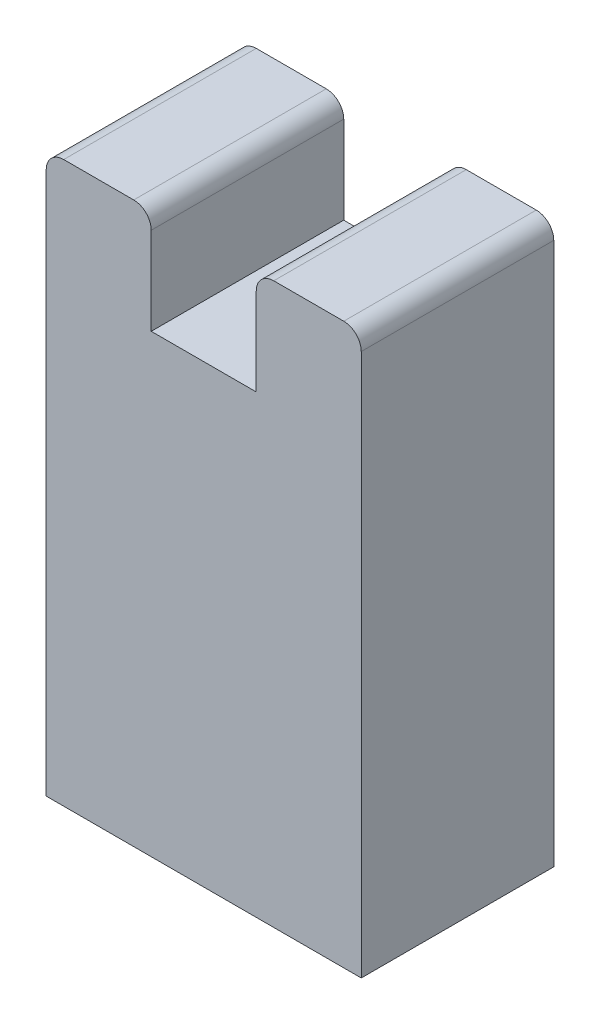
ISO-10303-21;
HEADER;
FILE_DESCRIPTION(('STEP AP214'),'2;1');
FILE_NAME('part.step','',(''),(''),'','','');
FILE_SCHEMA(('AUTOMOTIVE_DESIGN { 1 0 10303 214 1 1 1 1 }'));
ENDSEC;
DATA;
#1=APPLICATION_CONTEXT('core data for automotive mechanical design processes');
#2=APPLICATION_PROTOCOL_DEFINITION('international standard','automotive_design',2000,#1);
#3=PRODUCT_CONTEXT('',#1,'mechanical');
#4=PRODUCT('Part','Part','',(#3));
#5=PRODUCT_RELATED_PRODUCT_CATEGORY('part','',(#4));
#6=PRODUCT_DEFINITION_FORMATION('','',#4);
#7=PRODUCT_DEFINITION_CONTEXT('part definition',#1,'design');
#8=PRODUCT_DEFINITION('design','',#6,#7);
#9=PRODUCT_DEFINITION_SHAPE('','',#8);
#10=(LENGTH_UNIT() NAMED_UNIT(*) SI_UNIT(.MILLI.,.METRE.));
#11=(NAMED_UNIT(*) PLANE_ANGLE_UNIT() SI_UNIT($,.RADIAN.));
#12=(NAMED_UNIT(*) SI_UNIT($,.STERADIAN.) SOLID_ANGLE_UNIT());
#13=UNCERTAINTY_MEASURE_WITH_UNIT(LENGTH_MEASURE(1.E-05),#10,'distance_accuracy_value','');
#14=(GEOMETRIC_REPRESENTATION_CONTEXT(3) GLOBAL_UNCERTAINTY_ASSIGNED_CONTEXT((#13)) GLOBAL_UNIT_ASSIGNED_CONTEXT((#10,
#11,#12)) REPRESENTATION_CONTEXT('',''));
#15=CARTESIAN_POINT('',(0.,0.,0.));
#16=DIRECTION('',(0.,0.,1.));
#17=DIRECTION('',(1.,0.,0.));
#18=AXIS2_PLACEMENT_3D('',#15,#16,#17);
#19=CARTESIAN_POINT('',(0.,16.,5.5));
#20=DIRECTION('',(0.,-1.,0.));
#21=DIRECTION('',(0.,0.,-1.));
#22=AXIS2_PLACEMENT_3D('',#19,#20,#21);
#23=PLANE('',#22);
#24=DIRECTION('',(-1.,0.,0.));
#25=VECTOR('',#24,1.);
#26=CARTESIAN_POINT('',(0.,16.,5.5));
#27=LINE('',#26,#25);
#28=CARTESIAN_POINT('',(2.5,16.,5.5));
#29=VERTEX_POINT('',#28);
#30=CARTESIAN_POINT('',(0.5,16.,5.5));
#31=VERTEX_POINT('',#30);
#32=EDGE_CURVE('E168',#29,#31,#27,.T.);
#33=ORIENTED_EDGE('',*,*,#32,.F.);
#34=DIRECTION('',(0.,0.,1.));
#35=VECTOR('',#34,1.);
#36=CARTESIAN_POINT('',(2.5,16.,5.5));
#37=LINE('',#36,#35);
#38=CARTESIAN_POINT('',(2.5,16.,0.));
#39=VERTEX_POINT('',#38);
#40=EDGE_CURVE('E41',#29,#39,#37,.F.);
#41=ORIENTED_EDGE('',*,*,#40,.T.);
#42=DIRECTION('',(-1.,0.,0.));
#43=VECTOR('',#42,1.);
#44=CARTESIAN_POINT('',(0.,16.,0.));
#45=LINE('',#44,#43);
#46=CARTESIAN_POINT('',(0.5,16.,0.));
#47=VERTEX_POINT('',#46);
#48=EDGE_CURVE('E177',#39,#47,#45,.T.);
#49=ORIENTED_EDGE('',*,*,#48,.T.);
#50=DIRECTION('',(0.,0.,-1.));
#51=VECTOR('',#50,1.);
#52=CARTESIAN_POINT('',(0.5,16.,5.5));
#53=LINE('',#52,#51);
#54=EDGE_CURVE('E211',#47,#31,#53,.F.);
#55=ORIENTED_EDGE('',*,*,#54,.T.);
#56=EDGE_LOOP('',(#33,#41,#49,#55));
#57=FACE_BOUND('',#56,.T.);
#58=ADVANCED_FACE('F33',(#57),#23,.F.);
#59=CARTESIAN_POINT('',(0.,0.,5.5));
#60=DIRECTION('',(1.,0.,0.));
#61=DIRECTION('',(0.,0.,-1.));
#62=AXIS2_PLACEMENT_3D('',#59,#60,#61);
#63=PLANE('',#62);
#64=DIRECTION('',(0.,-1.,0.));
#65=VECTOR('',#64,1.);
#66=CARTESIAN_POINT('',(0.,0.,5.5));
#67=LINE('',#66,#65);
#68=CARTESIAN_POINT('',(0.,15.5,5.5));
#69=VERTEX_POINT('',#68);
#70=CARTESIAN_POINT('',(0.,0.,5.5));
#71=VERTEX_POINT('',#70);
#72=EDGE_CURVE('E160',#69,#71,#67,.T.);
#73=ORIENTED_EDGE('',*,*,#72,.F.);
#74=DIRECTION('',(0.,0.,-1.));
#75=VECTOR('',#74,1.);
#76=CARTESIAN_POINT('',(0.,15.5,5.5));
#77=LINE('',#76,#75);
#78=CARTESIAN_POINT('',(0.,15.5,0.));
#79=VERTEX_POINT('',#78);
#80=EDGE_CURVE('E11',#69,#79,#77,.T.);
#81=ORIENTED_EDGE('',*,*,#80,.T.);
#82=DIRECTION('',(0.,-1.,0.));
#83=VECTOR('',#82,1.);
#84=CARTESIAN_POINT('',(0.,0.,0.));
#85=LINE('',#84,#83);
#86=CARTESIAN_POINT('',(0.,0.,0.));
#87=VERTEX_POINT('',#86);
#88=EDGE_CURVE('E158',#79,#87,#85,.T.);
#89=ORIENTED_EDGE('',*,*,#88,.T.);
#90=DIRECTION('',(0.,0.,-1.));
#91=VECTOR('',#90,1.);
#92=CARTESIAN_POINT('',(0.,0.,5.5));
#93=LINE('',#92,#91);
#94=EDGE_CURVE('E183',#71,#87,#93,.T.);
#95=ORIENTED_EDGE('',*,*,#94,.F.);
#96=EDGE_LOOP('',(#73,#81,#89,#95));
#97=FACE_BOUND('',#96,.T.);
#98=ADVANCED_FACE('F247',(#97),#63,.F.);
#99=CARTESIAN_POINT('',(0.,0.,5.5));
#100=DIRECTION('',(0.,1.,0.));
#101=DIRECTION('',(0.,0.,1.));
#102=AXIS2_PLACEMENT_3D('',#99,#100,#101);
#103=PLANE('',#102);
#104=DIRECTION('',(1.,0.,0.));
#105=VECTOR('',#104,1.);
#106=CARTESIAN_POINT('',(0.,0.,0.));
#107=LINE('',#106,#105);
#108=CARTESIAN_POINT('',(9.,0.,0.));
#109=VERTEX_POINT('',#108);
#110=EDGE_CURVE('E172',#87,#109,#107,.T.);
#111=ORIENTED_EDGE('',*,*,#110,.T.);
#112=DIRECTION('',(0.,0.,-1.));
#113=VECTOR('',#112,1.);
#114=CARTESIAN_POINT('',(9.,0.,5.5));
#115=LINE('',#114,#113);
#116=CARTESIAN_POINT('',(9.,0.,5.5));
#117=VERTEX_POINT('',#116);
#118=EDGE_CURVE('E180',#117,#109,#115,.T.);
#119=ORIENTED_EDGE('',*,*,#118,.F.);
#120=DIRECTION('',(1.,0.,0.));
#121=VECTOR('',#120,1.);
#122=CARTESIAN_POINT('',(0.,0.,5.5));
#123=LINE('',#122,#121);
#124=EDGE_CURVE('E162',#71,#117,#123,.T.);
#125=ORIENTED_EDGE('',*,*,#124,.F.);
#126=ORIENTED_EDGE('',*,*,#94,.T.);
#127=EDGE_LOOP('',(#111,#119,#125,#126));
#128=FACE_BOUND('',#127,.T.);
#129=ADVANCED_FACE('F244',(#128),#103,.F.);
#130=CARTESIAN_POINT('',(9.,0.,5.5));
#131=DIRECTION('',(-1.,0.,0.));
#132=DIRECTION('',(0.,0.,1.));
#133=AXIS2_PLACEMENT_3D('',#130,#131,#132);
#134=PLANE('',#133);
#135=DIRECTION('',(0.,1.,0.));
#136=VECTOR('',#135,1.);
#137=CARTESIAN_POINT('',(9.,0.,0.));
#138=LINE('',#137,#136);
#139=CARTESIAN_POINT('',(9.,15.5,0.));
#140=VERTEX_POINT('',#139);
#141=EDGE_CURVE('E174',#109,#140,#138,.T.);
#142=ORIENTED_EDGE('',*,*,#141,.T.);
#143=DIRECTION('',(0.,0.,-1.));
#144=VECTOR('',#143,1.);
#145=CARTESIAN_POINT('',(9.,15.5,5.5));
#146=LINE('',#145,#144);
#147=CARTESIAN_POINT('',(9.,15.5,5.5));
#148=VERTEX_POINT('',#147);
#149=EDGE_CURVE('E199',#140,#148,#146,.F.);
#150=ORIENTED_EDGE('',*,*,#149,.T.);
#151=DIRECTION('',(0.,1.,0.));
#152=VECTOR('',#151,1.);
#153=CARTESIAN_POINT('',(9.,0.,5.5));
#154=LINE('',#153,#152);
#155=EDGE_CURVE('E165',#117,#148,#154,.T.);
#156=ORIENTED_EDGE('',*,*,#155,.F.);
#157=ORIENTED_EDGE('',*,*,#118,.T.);
#158=EDGE_LOOP('',(#142,#150,#156,#157));
#159=FACE_BOUND('',#158,.T.);
#160=ADVANCED_FACE('F239',(#159),#134,.F.);
#161=CARTESIAN_POINT('',(8.5,16.,5.5));
#162=VERTEX_POINT('',#161);
#163=CARTESIAN_POINT('',(6.5,16.,5.5));
#164=VERTEX_POINT('',#163);
#165=EDGE_CURVE('E170',#162,#164,#27,.T.);
#166=ORIENTED_EDGE('',*,*,#165,.F.);
#167=DIRECTION('',(0.,0.,-1.));
#168=VECTOR('',#167,1.);
#169=CARTESIAN_POINT('',(8.5,16.,5.5));
#170=LINE('',#169,#168);
#171=CARTESIAN_POINT('',(8.5,16.,0.));
#172=VERTEX_POINT('',#171);
#173=EDGE_CURVE('E189',#162,#172,#170,.T.);
#174=ORIENTED_EDGE('',*,*,#173,.T.);
#175=CARTESIAN_POINT('',(6.5,16.,0.));
#176=VERTEX_POINT('',#175);
#177=EDGE_CURVE('E163',#172,#176,#45,.T.);
#178=ORIENTED_EDGE('',*,*,#177,.T.);
#179=DIRECTION('',(0.,0.,1.));
#180=VECTOR('',#179,1.);
#181=CARTESIAN_POINT('',(6.5,16.,5.5));
#182=LINE('',#181,#180);
#183=EDGE_CURVE('E186',#176,#164,#182,.T.);
#184=ORIENTED_EDGE('',*,*,#183,.T.);
#185=EDGE_LOOP('',(#166,#174,#178,#184));
#186=FACE_BOUND('',#185,.T.);
#187=ADVANCED_FACE('F230',(#186),#23,.F.);
#188=CARTESIAN_POINT('',(0.,0.,5.5));
#189=DIRECTION('',(0.,0.,-1.));
#190=DIRECTION('',(-1.,0.,0.));
#191=AXIS2_PLACEMENT_3D('',#188,#189,#190);
#192=PLANE('',#191);
#193=ORIENTED_EDGE('',*,*,#155,.T.);
#194=CARTESIAN_POINT('',(8.5,15.5,5.5));
#195=DIRECTION('',(0.,0.,-1.));
#196=DIRECTION('',(-1.,0.,0.));
#197=AXIS2_PLACEMENT_3D('',#194,#195,#196);
#198=CIRCLE('',#197,0.5);
#199=EDGE_CURVE('E205',#148,#162,#198,.F.);
#200=ORIENTED_EDGE('',*,*,#199,.T.);
#201=ORIENTED_EDGE('',*,*,#165,.T.);
#202=CARTESIAN_POINT('',(6.5,15.5,5.5));
#203=DIRECTION('',(0.,0.,-1.));
#204=DIRECTION('',(-1.,0.,0.));
#205=AXIS2_PLACEMENT_3D('',#202,#203,#204);
#206=CIRCLE('',#205,0.5);
#207=CARTESIAN_POINT('',(6.,15.5,5.5));
#208=VERTEX_POINT('',#207);
#209=EDGE_CURVE('E48',#164,#208,#206,.F.);
#210=ORIENTED_EDGE('',*,*,#209,.T.);
#211=DIRECTION('',(0.,1.,0.));
#212=VECTOR('',#211,1.);
#213=CARTESIAN_POINT('',(6.,16.,5.5));
#214=LINE('',#213,#212);
#215=CARTESIAN_POINT('',(6.,13.,5.5));
#216=VERTEX_POINT('',#215);
#217=EDGE_CURVE('E136',#216,#208,#214,.T.);
#218=ORIENTED_EDGE('',*,*,#217,.F.);
#219=DIRECTION('',(1.,0.,0.));
#220=VECTOR('',#219,1.);
#221=CARTESIAN_POINT('',(3.,13.,5.5));
#222=LINE('',#221,#220);
#223=CARTESIAN_POINT('',(3.,13.,5.5));
#224=VERTEX_POINT('',#223);
#225=EDGE_CURVE('E155',#224,#216,#222,.T.);
#226=ORIENTED_EDGE('',*,*,#225,.F.);
#227=DIRECTION('',(0.,-1.,0.));
#228=VECTOR('',#227,1.);
#229=CARTESIAN_POINT('',(3.,16.,5.5));
#230=LINE('',#229,#228);
#231=CARTESIAN_POINT('',(3.,15.5,5.5));
#232=VERTEX_POINT('',#231);
#233=EDGE_CURVE('E142',#232,#224,#230,.T.);
#234=ORIENTED_EDGE('',*,*,#233,.F.);
#235=CARTESIAN_POINT('',(2.5,15.5,5.5));
#236=DIRECTION('',(0.,0.,-1.));
#237=DIRECTION('',(-1.,0.,0.));
#238=AXIS2_PLACEMENT_3D('',#235,#236,#237);
#239=CIRCLE('',#238,0.5);
#240=EDGE_CURVE('E202',#232,#29,#239,.F.);
#241=ORIENTED_EDGE('',*,*,#240,.T.);
#242=ORIENTED_EDGE('',*,*,#32,.T.);
#243=CARTESIAN_POINT('',(0.5,15.5,5.5));
#244=DIRECTION('',(0.,0.,-1.));
#245=DIRECTION('',(-1.,0.,0.));
#246=AXIS2_PLACEMENT_3D('',#243,#244,#245);
#247=CIRCLE('',#246,0.5);
#248=EDGE_CURVE('E55',#31,#69,#247,.F.);
#249=ORIENTED_EDGE('',*,*,#248,.T.);
#250=ORIENTED_EDGE('',*,*,#72,.T.);
#251=ORIENTED_EDGE('',*,*,#124,.T.);
#252=EDGE_LOOP('',(#193,#200,#201,#210,#218,#226,#234,#241,#242,#249,#250,#251));
#253=FACE_BOUND('',#252,.T.);
#254=ADVANCED_FACE('F219',(#253),#192,.F.);
#255=CARTESIAN_POINT('',(0.,0.,0.));
#256=DIRECTION('',(0.,0.,-1.));
#257=DIRECTION('',(-1.,0.,0.));
#258=AXIS2_PLACEMENT_3D('',#255,#256,#257);
#259=PLANE('',#258);
#260=ORIENTED_EDGE('',*,*,#177,.F.);
#261=CARTESIAN_POINT('',(8.5,15.5,0.));
#262=DIRECTION('',(0.,0.,-1.));
#263=DIRECTION('',(-1.,0.,0.));
#264=AXIS2_PLACEMENT_3D('',#261,#262,#263);
#265=CIRCLE('',#264,0.5);
#266=EDGE_CURVE('E197',#172,#140,#265,.T.);
#267=ORIENTED_EDGE('',*,*,#266,.T.);
#268=ORIENTED_EDGE('',*,*,#141,.F.);
#269=ORIENTED_EDGE('',*,*,#110,.F.);
#270=ORIENTED_EDGE('',*,*,#88,.F.);
#271=CARTESIAN_POINT('',(0.5,15.5,0.));
#272=DIRECTION('',(0.,0.,-1.));
#273=DIRECTION('',(-1.,0.,0.));
#274=AXIS2_PLACEMENT_3D('',#271,#272,#273);
#275=CIRCLE('',#274,0.5);
#276=EDGE_CURVE('E192',#79,#47,#275,.T.);
#277=ORIENTED_EDGE('',*,*,#276,.T.);
#278=ORIENTED_EDGE('',*,*,#48,.F.);
#279=CARTESIAN_POINT('',(2.5,15.5,0.));
#280=DIRECTION('',(0.,0.,-1.));
#281=DIRECTION('',(-1.,0.,0.));
#282=AXIS2_PLACEMENT_3D('',#279,#280,#281);
#283=CIRCLE('',#282,0.5);
#284=CARTESIAN_POINT('',(3.,15.5,0.));
#285=VERTEX_POINT('',#284);
#286=EDGE_CURVE('E132',#39,#285,#283,.T.);
#287=ORIENTED_EDGE('',*,*,#286,.T.);
#288=DIRECTION('',(0.,-1.,0.));
#289=VECTOR('',#288,1.);
#290=CARTESIAN_POINT('',(3.,16.,0.));
#291=LINE('',#290,#289);
#292=CARTESIAN_POINT('',(3.,13.,0.));
#293=VERTEX_POINT('',#292);
#294=EDGE_CURVE('E123',#285,#293,#291,.T.);
#295=ORIENTED_EDGE('',*,*,#294,.T.);
#296=DIRECTION('',(1.,0.,0.));
#297=VECTOR('',#296,1.);
#298=CARTESIAN_POINT('',(3.,13.,0.));
#299=LINE('',#298,#297);
#300=CARTESIAN_POINT('',(6.,13.,0.));
#301=VERTEX_POINT('',#300);
#302=EDGE_CURVE('E129',#293,#301,#299,.T.);
#303=ORIENTED_EDGE('',*,*,#302,.T.);
#304=DIRECTION('',(0.,1.,0.));
#305=VECTOR('',#304,1.);
#306=CARTESIAN_POINT('',(6.,16.,0.));
#307=LINE('',#306,#305);
#308=CARTESIAN_POINT('',(6.,15.5,0.));
#309=VERTEX_POINT('',#308);
#310=EDGE_CURVE('E147',#301,#309,#307,.T.);
#311=ORIENTED_EDGE('',*,*,#310,.T.);
#312=CARTESIAN_POINT('',(6.5,15.5,0.));
#313=DIRECTION('',(0.,0.,-1.));
#314=DIRECTION('',(-1.,0.,0.));
#315=AXIS2_PLACEMENT_3D('',#312,#313,#314);
#316=CIRCLE('',#315,0.5);
#317=EDGE_CURVE('E195',#309,#176,#316,.T.);
#318=ORIENTED_EDGE('',*,*,#317,.T.);
#319=EDGE_LOOP('',(#260,#267,#268,#269,#270,#277,#278,#287,#295,#303,#311,#318));
#320=FACE_BOUND('',#319,.T.);
#321=ADVANCED_FACE('F126',(#320),#259,.T.);
#322=CARTESIAN_POINT('',(3.,16.,0.));
#323=DIRECTION('',(-1.,0.,0.));
#324=DIRECTION('',(0.,-1.,0.));
#325=AXIS2_PLACEMENT_3D('',#322,#323,#324);
#326=PLANE('',#325);
#327=ORIENTED_EDGE('',*,*,#294,.F.);
#328=DIRECTION('',(0.,0.,1.));
#329=VECTOR('',#328,1.);
#330=CARTESIAN_POINT('',(3.,15.5,0.));
#331=LINE('',#330,#329);
#332=EDGE_CURVE('E209',#285,#232,#331,.T.);
#333=ORIENTED_EDGE('',*,*,#332,.T.);
#334=ORIENTED_EDGE('',*,*,#233,.T.);
#335=DIRECTION('',(0.,0.,1.));
#336=VECTOR('',#335,1.);
#337=CARTESIAN_POINT('',(3.,13.,0.));
#338=LINE('',#337,#336);
#339=EDGE_CURVE('E139',#293,#224,#338,.T.);
#340=ORIENTED_EDGE('',*,*,#339,.F.);
#341=EDGE_LOOP('',(#327,#333,#334,#340));
#342=FACE_BOUND('',#341,.T.);
#343=ADVANCED_FACE('F140',(#342),#326,.F.);
#344=CARTESIAN_POINT('',(6.,16.,0.));
#345=DIRECTION('',(1.,0.,0.));
#346=DIRECTION('',(0.,0.,-1.));
#347=AXIS2_PLACEMENT_3D('',#344,#345,#346);
#348=PLANE('',#347);
#349=ORIENTED_EDGE('',*,*,#217,.T.);
#350=DIRECTION('',(0.,0.,1.));
#351=VECTOR('',#350,1.);
#352=CARTESIAN_POINT('',(6.,15.5,0.));
#353=LINE('',#352,#351);
#354=EDGE_CURVE('E207',#208,#309,#353,.F.);
#355=ORIENTED_EDGE('',*,*,#354,.T.);
#356=ORIENTED_EDGE('',*,*,#310,.F.);
#357=DIRECTION('',(0.,0.,1.));
#358=VECTOR('',#357,1.);
#359=CARTESIAN_POINT('',(6.,13.,0.));
#360=LINE('',#359,#358);
#361=EDGE_CURVE('E146',#301,#216,#360,.T.);
#362=ORIENTED_EDGE('',*,*,#361,.T.);
#363=EDGE_LOOP('',(#349,#355,#356,#362));
#364=FACE_BOUND('',#363,.T.);
#365=ADVANCED_FACE('F222',(#364),#348,.F.);
#366=CARTESIAN_POINT('',(3.,13.,0.));
#367=DIRECTION('',(0.,-1.,0.));
#368=DIRECTION('',(0.,0.,-1.));
#369=AXIS2_PLACEMENT_3D('',#366,#367,#368);
#370=PLANE('',#369);
#371=ORIENTED_EDGE('',*,*,#225,.T.);
#372=ORIENTED_EDGE('',*,*,#361,.F.);
#373=ORIENTED_EDGE('',*,*,#302,.F.);
#374=ORIENTED_EDGE('',*,*,#339,.T.);
#375=EDGE_LOOP('',(#371,#372,#373,#374));
#376=FACE_BOUND('',#375,.T.);
#377=ADVANCED_FACE('F150',(#376),#370,.F.);
#378=CARTESIAN_POINT('',(8.5,15.5,5.5));
#379=DIRECTION('',(0.,0.,-1.));
#380=DIRECTION('',(-1.,0.,0.));
#381=AXIS2_PLACEMENT_3D('',#378,#379,#380);
#382=CYLINDRICAL_SURFACE('',#381,0.5);
#383=ORIENTED_EDGE('',*,*,#199,.F.);
#384=ORIENTED_EDGE('',*,*,#149,.F.);
#385=ORIENTED_EDGE('',*,*,#266,.F.);
#386=ORIENTED_EDGE('',*,*,#173,.F.);
#387=EDGE_LOOP('',(#383,#384,#385,#386));
#388=FACE_BOUND('',#387,.T.);
#389=ADVANCED_FACE('F234',(#388),#382,.T.);
#390=CARTESIAN_POINT('',(6.5,15.5,5.5));
#391=DIRECTION('',(0.,0.,1.));
#392=DIRECTION('',(1.,0.,0.));
#393=AXIS2_PLACEMENT_3D('',#390,#391,#392);
#394=CYLINDRICAL_SURFACE('',#393,0.5);
#395=ORIENTED_EDGE('',*,*,#317,.F.);
#396=ORIENTED_EDGE('',*,*,#354,.F.);
#397=ORIENTED_EDGE('',*,*,#209,.F.);
#398=ORIENTED_EDGE('',*,*,#183,.F.);
#399=EDGE_LOOP('',(#395,#396,#397,#398));
#400=FACE_BOUND('',#399,.T.);
#401=ADVANCED_FACE('F225',(#400),#394,.T.);
#402=CARTESIAN_POINT('',(2.5,15.5,0.));
#403=DIRECTION('',(0.,0.,1.));
#404=DIRECTION('',(1.,0.,0.));
#405=AXIS2_PLACEMENT_3D('',#402,#403,#404);
#406=CYLINDRICAL_SURFACE('',#405,0.5);
#407=ORIENTED_EDGE('',*,*,#286,.F.);
#408=ORIENTED_EDGE('',*,*,#40,.F.);
#409=ORIENTED_EDGE('',*,*,#240,.F.);
#410=ORIENTED_EDGE('',*,*,#332,.F.);
#411=EDGE_LOOP('',(#407,#408,#409,#410));
#412=FACE_BOUND('',#411,.T.);
#413=ADVANCED_FACE('F218',(#412),#406,.T.);
#414=CARTESIAN_POINT('',(0.5,15.5,5.5));
#415=DIRECTION('',(0.,0.,-1.));
#416=DIRECTION('',(-1.,0.,0.));
#417=AXIS2_PLACEMENT_3D('',#414,#415,#416);
#418=CYLINDRICAL_SURFACE('',#417,0.5);
#419=ORIENTED_EDGE('',*,*,#248,.F.);
#420=ORIENTED_EDGE('',*,*,#54,.F.);
#421=ORIENTED_EDGE('',*,*,#276,.F.);
#422=ORIENTED_EDGE('',*,*,#80,.F.);
#423=EDGE_LOOP('',(#419,#420,#421,#422));
#424=FACE_BOUND('',#423,.T.);
#425=ADVANCED_FACE('F35',(#424),#418,.T.);
#426=CLOSED_SHELL('',(#58,#98,#129,#160,#187,#254,#321,#343,#365,#377,#389,#401,#413,#425));
#427=MANIFOLD_SOLID_BREP('B2',#426);
#428=ADVANCED_BREP_SHAPE_REPRESENTATION('',(#18,#427),#14);
#429=SHAPE_DEFINITION_REPRESENTATION(#9,#428);
ENDSEC;
END-ISO-10303-21;
